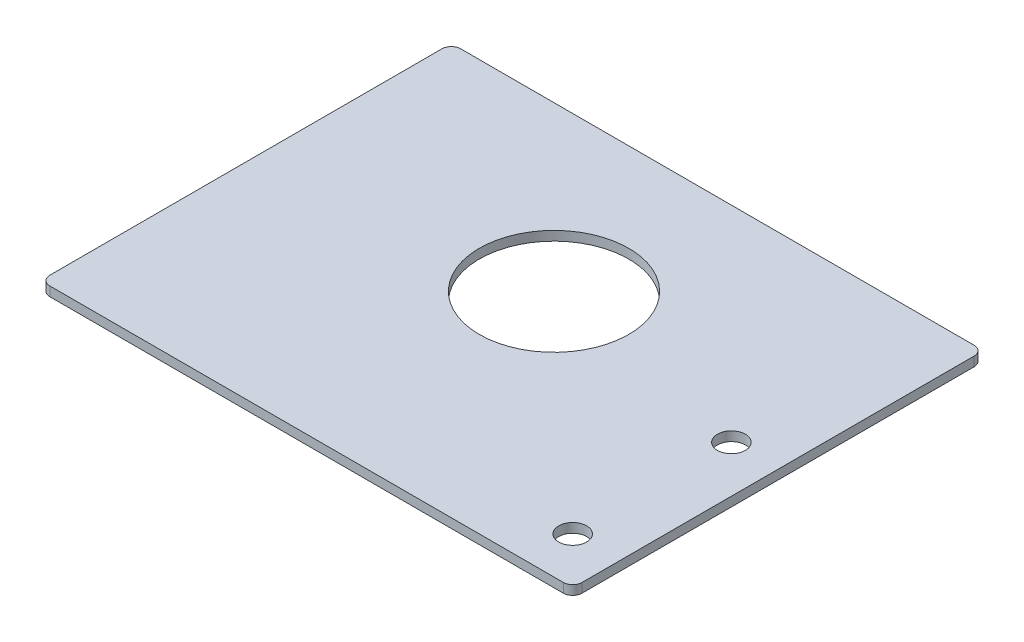
ISO-10303-21;
HEADER;
FILE_DESCRIPTION(('STEP AP214'),'2;1');
FILE_NAME('part.step','',(''),(''),'','','');
FILE_SCHEMA(('AUTOMOTIVE_DESIGN { 1 0 10303 214 1 1 1 1 }'));
ENDSEC;
DATA;
#1=APPLICATION_CONTEXT('core data for automotive mechanical design processes');
#2=APPLICATION_PROTOCOL_DEFINITION('international standard','automotive_design',2000,#1);
#3=PRODUCT_CONTEXT('',#1,'mechanical');
#4=PRODUCT('Part','Part','',(#3));
#5=PRODUCT_RELATED_PRODUCT_CATEGORY('part','',(#4));
#6=PRODUCT_DEFINITION_FORMATION('','',#4);
#7=PRODUCT_DEFINITION_CONTEXT('part definition',#1,'design');
#8=PRODUCT_DEFINITION('design','',#6,#7);
#9=PRODUCT_DEFINITION_SHAPE('','',#8);
#10=(LENGTH_UNIT() NAMED_UNIT(*) SI_UNIT(.MILLI.,.METRE.));
#11=(NAMED_UNIT(*) PLANE_ANGLE_UNIT() SI_UNIT($,.RADIAN.));
#12=(NAMED_UNIT(*) SI_UNIT($,.STERADIAN.) SOLID_ANGLE_UNIT());
#13=UNCERTAINTY_MEASURE_WITH_UNIT(LENGTH_MEASURE(1.E-05),#10,'distance_accuracy_value','');
#14=(GEOMETRIC_REPRESENTATION_CONTEXT(3) GLOBAL_UNCERTAINTY_ASSIGNED_CONTEXT((#13)) GLOBAL_UNIT_ASSIGNED_CONTEXT((#10,
#11,#12)) REPRESENTATION_CONTEXT('',''));
#15=CARTESIAN_POINT('',(0.,0.,0.));
#16=DIRECTION('',(0.,0.,1.));
#17=DIRECTION('',(1.,0.,0.));
#18=AXIS2_PLACEMENT_3D('',#15,#16,#17);
#19=CARTESIAN_POINT('',(55.,2.,42.));
#20=DIRECTION('',(0.,1.,0.));
#21=DIRECTION('',(0.,0.,1.));
#22=AXIS2_PLACEMENT_3D('',#19,#20,#21);
#23=CYLINDRICAL_SURFACE('',#22,2.);
#24=DIRECTION('',(0.,1.,0.));
#25=VECTOR('',#24,1.);
#26=CARTESIAN_POINT('',(55.,2.,44.));
#27=LINE('',#26,#25);
#28=CARTESIAN_POINT('',(55.,2.,44.));
#29=VERTEX_POINT('',#28);
#30=CARTESIAN_POINT('',(55.,4.,44.));
#31=VERTEX_POINT('',#30);
#32=EDGE_CURVE('E11',#29,#31,#27,.T.);
#33=ORIENTED_EDGE('',*,*,#32,.F.);
#34=CARTESIAN_POINT('',(55.,2.,42.));
#35=DIRECTION('',(0.,1.,0.));
#36=DIRECTION('',(0.,0.,1.));
#37=AXIS2_PLACEMENT_3D('',#34,#35,#36);
#38=CIRCLE('',#37,2.);
#39=CARTESIAN_POINT('',(57.,2.,42.));
#40=VERTEX_POINT('',#39);
#41=EDGE_CURVE('E147',#29,#40,#38,.T.);
#42=ORIENTED_EDGE('',*,*,#41,.T.);
#43=DIRECTION('',(0.,1.,0.));
#44=VECTOR('',#43,1.);
#45=CARTESIAN_POINT('',(57.,2.,42.));
#46=LINE('',#45,#44);
#47=CARTESIAN_POINT('',(57.,4.,42.));
#48=VERTEX_POINT('',#47);
#49=EDGE_CURVE('E49',#40,#48,#46,.T.);
#50=ORIENTED_EDGE('',*,*,#49,.T.);
#51=CARTESIAN_POINT('',(55.,4.,42.));
#52=DIRECTION('',(0.,1.,0.));
#53=DIRECTION('',(0.,0.,1.));
#54=AXIS2_PLACEMENT_3D('',#51,#52,#53);
#55=CIRCLE('',#54,2.);
#56=EDGE_CURVE('E146',#31,#48,#55,.T.);
#57=ORIENTED_EDGE('',*,*,#56,.F.);
#58=EDGE_LOOP('',(#33,#42,#50,#57));
#59=FACE_BOUND('',#58,.T.);
#60=ADVANCED_FACE('F39',(#59),#23,.T.);
#61=CARTESIAN_POINT('',(57.,2.,-42.));
#62=DIRECTION('',(1.,0.,0.));
#63=DIRECTION('',(0.,0.,-1.));
#64=AXIS2_PLACEMENT_3D('',#61,#62,#63);
#65=PLANE('',#64);
#66=ORIENTED_EDGE('',*,*,#49,.F.);
#67=DIRECTION('',(0.,0.,-1.));
#68=VECTOR('',#67,1.);
#69=CARTESIAN_POINT('',(57.,2.,-42.));
#70=LINE('',#69,#68);
#71=CARTESIAN_POINT('',(57.,2.,-42.));
#72=VERTEX_POINT('',#71);
#73=EDGE_CURVE('E182',#40,#72,#70,.T.);
#74=ORIENTED_EDGE('',*,*,#73,.T.);
#75=DIRECTION('',(0.,1.,0.));
#76=VECTOR('',#75,1.);
#77=CARTESIAN_POINT('',(57.,2.,-42.));
#78=LINE('',#77,#76);
#79=CARTESIAN_POINT('',(57.,4.,-42.));
#80=VERTEX_POINT('',#79);
#81=EDGE_CURVE('E140',#72,#80,#78,.T.);
#82=ORIENTED_EDGE('',*,*,#81,.T.);
#83=DIRECTION('',(0.,0.,1.));
#84=VECTOR('',#83,1.);
#85=CARTESIAN_POINT('',(57.,4.,42.));
#86=LINE('',#85,#84);
#87=EDGE_CURVE('E158',#48,#80,#86,.F.);
#88=ORIENTED_EDGE('',*,*,#87,.F.);
#89=EDGE_LOOP('',(#66,#74,#82,#88));
#90=FACE_BOUND('',#89,.T.);
#91=ADVANCED_FACE('F163',(#90),#65,.T.);
#92=CARTESIAN_POINT('',(55.,2.,-42.));
#93=DIRECTION('',(0.,1.,0.));
#94=DIRECTION('',(0.,0.,1.));
#95=AXIS2_PLACEMENT_3D('',#92,#93,#94);
#96=CYLINDRICAL_SURFACE('',#95,2.);
#97=ORIENTED_EDGE('',*,*,#81,.F.);
#98=CARTESIAN_POINT('',(55.,2.,-42.));
#99=DIRECTION('',(0.,1.,0.));
#100=DIRECTION('',(0.,0.,1.));
#101=AXIS2_PLACEMENT_3D('',#98,#99,#100);
#102=CIRCLE('',#101,2.);
#103=CARTESIAN_POINT('',(55.,2.,-44.));
#104=VERTEX_POINT('',#103);
#105=EDGE_CURVE('E184',#72,#104,#102,.T.);
#106=ORIENTED_EDGE('',*,*,#105,.T.);
#107=DIRECTION('',(0.,1.,0.));
#108=VECTOR('',#107,1.);
#109=CARTESIAN_POINT('',(55.,2.,-44.));
#110=LINE('',#109,#108);
#111=CARTESIAN_POINT('',(55.,4.,-44.));
#112=VERTEX_POINT('',#111);
#113=EDGE_CURVE('E138',#104,#112,#110,.T.);
#114=ORIENTED_EDGE('',*,*,#113,.T.);
#115=CARTESIAN_POINT('',(55.,4.,-42.));
#116=DIRECTION('',(0.,1.,0.));
#117=DIRECTION('',(0.,0.,1.));
#118=AXIS2_PLACEMENT_3D('',#115,#116,#117);
#119=CIRCLE('',#118,2.);
#120=EDGE_CURVE('E164',#80,#112,#119,.T.);
#121=ORIENTED_EDGE('',*,*,#120,.F.);
#122=EDGE_LOOP('',(#97,#106,#114,#121));
#123=FACE_BOUND('',#122,.T.);
#124=ADVANCED_FACE('F194',(#123),#96,.T.);
#125=CARTESIAN_POINT('',(-55.,2.,-44.));
#126=DIRECTION('',(0.,0.,-1.));
#127=DIRECTION('',(-1.,0.,0.));
#128=AXIS2_PLACEMENT_3D('',#125,#126,#127);
#129=PLANE('',#128);
#130=ORIENTED_EDGE('',*,*,#113,.F.);
#131=DIRECTION('',(-1.,0.,0.));
#132=VECTOR('',#131,1.);
#133=CARTESIAN_POINT('',(-55.,2.,-44.));
#134=LINE('',#133,#132);
#135=CARTESIAN_POINT('',(-55.,2.,-44.));
#136=VERTEX_POINT('',#135);
#137=EDGE_CURVE('E128',#104,#136,#134,.T.);
#138=ORIENTED_EDGE('',*,*,#137,.T.);
#139=DIRECTION('',(0.,1.,0.));
#140=VECTOR('',#139,1.);
#141=CARTESIAN_POINT('',(-55.,2.,-44.));
#142=LINE('',#141,#140);
#143=CARTESIAN_POINT('',(-55.,4.,-44.));
#144=VERTEX_POINT('',#143);
#145=EDGE_CURVE('E136',#136,#144,#142,.T.);
#146=ORIENTED_EDGE('',*,*,#145,.T.);
#147=DIRECTION('',(1.,0.,0.));
#148=VECTOR('',#147,1.);
#149=CARTESIAN_POINT('',(-55.,4.,-44.));
#150=LINE('',#149,#148);
#151=EDGE_CURVE('E166',#112,#144,#150,.F.);
#152=ORIENTED_EDGE('',*,*,#151,.F.);
#153=EDGE_LOOP('',(#130,#138,#146,#152));
#154=FACE_BOUND('',#153,.T.);
#155=ADVANCED_FACE('F189',(#154),#129,.T.);
#156=CARTESIAN_POINT('',(-55.,2.,-42.));
#157=DIRECTION('',(0.,1.,0.));
#158=DIRECTION('',(0.,0.,1.));
#159=AXIS2_PLACEMENT_3D('',#156,#157,#158);
#160=CYLINDRICAL_SURFACE('',#159,2.);
#161=ORIENTED_EDGE('',*,*,#145,.F.);
#162=CARTESIAN_POINT('',(-55.,2.,-42.));
#163=DIRECTION('',(0.,1.,0.));
#164=DIRECTION('',(0.,0.,1.));
#165=AXIS2_PLACEMENT_3D('',#162,#163,#164);
#166=CIRCLE('',#165,2.);
#167=CARTESIAN_POINT('',(-57.,2.,-42.));
#168=VERTEX_POINT('',#167);
#169=EDGE_CURVE('E123',#136,#168,#166,.T.);
#170=ORIENTED_EDGE('',*,*,#169,.T.);
#171=DIRECTION('',(0.,1.,0.));
#172=VECTOR('',#171,1.);
#173=CARTESIAN_POINT('',(-57.,2.,-42.));
#174=LINE('',#173,#172);
#175=CARTESIAN_POINT('',(-57.,4.,-42.));
#176=VERTEX_POINT('',#175);
#177=EDGE_CURVE('E98',#168,#176,#174,.T.);
#178=ORIENTED_EDGE('',*,*,#177,.T.);
#179=CARTESIAN_POINT('',(-55.,4.,-42.));
#180=DIRECTION('',(0.,1.,0.));
#181=DIRECTION('',(0.,0.,1.));
#182=AXIS2_PLACEMENT_3D('',#179,#180,#181);
#183=CIRCLE('',#182,2.);
#184=EDGE_CURVE('E197',#144,#176,#183,.T.);
#185=ORIENTED_EDGE('',*,*,#184,.F.);
#186=EDGE_LOOP('',(#161,#170,#178,#185));
#187=FACE_BOUND('',#186,.T.);
#188=ADVANCED_FACE('F287',(#187),#160,.T.);
#189=CARTESIAN_POINT('',(-57.,2.,-42.));
#190=DIRECTION('',(-1.,0.,0.));
#191=DIRECTION('',(0.,0.,1.));
#192=AXIS2_PLACEMENT_3D('',#189,#190,#191);
#193=PLANE('',#192);
#194=ORIENTED_EDGE('',*,*,#177,.F.);
#195=DIRECTION('',(0.,0.,1.));
#196=VECTOR('',#195,1.);
#197=CARTESIAN_POINT('',(-57.,2.,-42.));
#198=LINE('',#197,#196);
#199=CARTESIAN_POINT('',(-57.,2.,42.));
#200=VERTEX_POINT('',#199);
#201=EDGE_CURVE('E115',#168,#200,#198,.T.);
#202=ORIENTED_EDGE('',*,*,#201,.T.);
#203=DIRECTION('',(0.,1.,0.));
#204=VECTOR('',#203,1.);
#205=CARTESIAN_POINT('',(-57.,2.,42.));
#206=LINE('',#205,#204);
#207=CARTESIAN_POINT('',(-57.,4.,42.));
#208=VERTEX_POINT('',#207);
#209=EDGE_CURVE('E57',#200,#208,#206,.T.);
#210=ORIENTED_EDGE('',*,*,#209,.T.);
#211=DIRECTION('',(0.,0.,1.));
#212=VECTOR('',#211,1.);
#213=CARTESIAN_POINT('',(-57.,4.,42.));
#214=LINE('',#213,#212);
#215=EDGE_CURVE('E175',#176,#208,#214,.T.);
#216=ORIENTED_EDGE('',*,*,#215,.F.);
#217=EDGE_LOOP('',(#194,#202,#210,#216));
#218=FACE_BOUND('',#217,.T.);
#219=ADVANCED_FACE('F121',(#218),#193,.T.);
#220=CARTESIAN_POINT('',(-55.,2.,42.));
#221=DIRECTION('',(0.,1.,0.));
#222=DIRECTION('',(0.,0.,1.));
#223=AXIS2_PLACEMENT_3D('',#220,#221,#222);
#224=CYLINDRICAL_SURFACE('',#223,2.);
#225=ORIENTED_EDGE('',*,*,#209,.F.);
#226=CARTESIAN_POINT('',(-55.,2.,42.));
#227=DIRECTION('',(0.,1.,0.));
#228=DIRECTION('',(0.,0.,1.));
#229=AXIS2_PLACEMENT_3D('',#226,#227,#228);
#230=CIRCLE('',#229,2.);
#231=CARTESIAN_POINT('',(-55.,2.,44.));
#232=VERTEX_POINT('',#231);
#233=EDGE_CURVE('E104',#200,#232,#230,.T.);
#234=ORIENTED_EDGE('',*,*,#233,.T.);
#235=DIRECTION('',(0.,1.,0.));
#236=VECTOR('',#235,1.);
#237=CARTESIAN_POINT('',(-55.,2.,44.));
#238=LINE('',#237,#236);
#239=CARTESIAN_POINT('',(-55.,4.,44.));
#240=VERTEX_POINT('',#239);
#241=EDGE_CURVE('E43',#232,#240,#238,.T.);
#242=ORIENTED_EDGE('',*,*,#241,.T.);
#243=CARTESIAN_POINT('',(-55.,4.,42.));
#244=DIRECTION('',(0.,1.,0.));
#245=DIRECTION('',(0.,0.,1.));
#246=AXIS2_PLACEMENT_3D('',#243,#244,#245);
#247=CIRCLE('',#246,2.);
#248=EDGE_CURVE('E106',#208,#240,#247,.T.);
#249=ORIENTED_EDGE('',*,*,#248,.F.);
#250=EDGE_LOOP('',(#225,#234,#242,#249));
#251=FACE_BOUND('',#250,.T.);
#252=ADVANCED_FACE('F103',(#251),#224,.T.);
#253=CARTESIAN_POINT('',(47.,2.,0.));
#254=DIRECTION('',(0.,1.,0.));
#255=DIRECTION('',(0.,0.,1.));
#256=AXIS2_PLACEMENT_3D('',#253,#254,#255);
#257=CYLINDRICAL_SURFACE('',#256,3.);
#258=CARTESIAN_POINT('',(47.,4.,0.));
#259=DIRECTION('',(0.,1.,0.));
#260=DIRECTION('',(0.,0.,1.));
#261=AXIS2_PLACEMENT_3D('',#258,#259,#260);
#262=CIRCLE('',#261,3.);
#263=CARTESIAN_POINT('',(47.,4.,3.));
#264=VERTEX_POINT('',#263);
#265=EDGE_CURVE('E133',#264,#264,#262,.T.);
#266=ORIENTED_EDGE('',*,*,#265,.T.);
#267=EDGE_LOOP('',(#266));
#268=FACE_BOUND('',#267,.T.);
#269=CARTESIAN_POINT('',(47.,2.,0.));
#270=DIRECTION('',(0.,1.,0.));
#271=DIRECTION('',(0.,0.,1.));
#272=AXIS2_PLACEMENT_3D('',#269,#270,#271);
#273=CIRCLE('',#272,3.);
#274=CARTESIAN_POINT('',(47.,2.,3.));
#275=VERTEX_POINT('',#274);
#276=EDGE_CURVE('E119',#275,#275,#273,.T.);
#277=ORIENTED_EDGE('',*,*,#276,.F.);
#278=EDGE_LOOP('',(#277));
#279=FACE_BOUND('',#278,.T.);
#280=ADVANCED_FACE('F205',(#268,#279),#257,.F.);
#281=CARTESIAN_POINT('',(-55.,2.,44.));
#282=DIRECTION('',(0.,0.,1.));
#283=DIRECTION('',(1.,0.,0.));
#284=AXIS2_PLACEMENT_3D('',#281,#282,#283);
#285=PLANE('',#284);
#286=DIRECTION('',(1.,0.,0.));
#287=VECTOR('',#286,1.);
#288=CARTESIAN_POINT('',(-55.,2.,44.));
#289=LINE('',#288,#287);
#290=EDGE_CURVE('E118',#232,#29,#289,.T.);
#291=ORIENTED_EDGE('',*,*,#290,.T.);
#292=ORIENTED_EDGE('',*,*,#32,.T.);
#293=DIRECTION('',(1.,0.,0.));
#294=VECTOR('',#293,1.);
#295=CARTESIAN_POINT('',(-55.,4.,44.));
#296=LINE('',#295,#294);
#297=EDGE_CURVE('E161',#240,#31,#296,.T.);
#298=ORIENTED_EDGE('',*,*,#297,.F.);
#299=ORIENTED_EDGE('',*,*,#241,.F.);
#300=EDGE_LOOP('',(#291,#292,#298,#299));
#301=FACE_BOUND('',#300,.T.);
#302=ADVANCED_FACE('F226',(#301),#285,.T.);
#303=CARTESIAN_POINT('',(0.,2.,-8.99999999999999));
#304=DIRECTION('',(0.,1.,0.));
#305=DIRECTION('',(0.,0.,1.));
#306=AXIS2_PLACEMENT_3D('',#303,#304,#305);
#307=CYLINDRICAL_SURFACE('',#306,16.);
#308=CARTESIAN_POINT('',(0.,4.,-8.99999999999999));
#309=DIRECTION('',(0.,1.,0.));
#310=DIRECTION('',(0.,0.,1.));
#311=AXIS2_PLACEMENT_3D('',#308,#309,#310);
#312=CIRCLE('',#311,16.);
#313=CARTESIAN_POINT('',(0.,4.,7.00000000000001));
#314=VERTEX_POINT('',#313);
#315=EDGE_CURVE('E171',#314,#314,#312,.T.);
#316=ORIENTED_EDGE('',*,*,#315,.T.);
#317=EDGE_LOOP('',(#316));
#318=FACE_BOUND('',#317,.T.);
#319=CARTESIAN_POINT('',(0.,2.,-8.99999999999999));
#320=DIRECTION('',(0.,1.,0.));
#321=DIRECTION('',(0.,0.,1.));
#322=AXIS2_PLACEMENT_3D('',#319,#320,#321);
#323=CIRCLE('',#322,16.);
#324=CARTESIAN_POINT('',(0.,2.,7.00000000000001));
#325=VERTEX_POINT('',#324);
#326=EDGE_CURVE('E122',#325,#325,#323,.T.);
#327=ORIENTED_EDGE('',*,*,#326,.F.);
#328=EDGE_LOOP('',(#327));
#329=FACE_BOUND('',#328,.T.);
#330=ADVANCED_FACE('F216',(#318,#329),#307,.F.);
#331=CARTESIAN_POINT('',(47.,2.,34.));
#332=DIRECTION('',(0.,1.,0.));
#333=DIRECTION('',(0.,0.,1.));
#334=AXIS2_PLACEMENT_3D('',#331,#332,#333);
#335=CYLINDRICAL_SURFACE('',#334,3.);
#336=CARTESIAN_POINT('',(47.,4.,34.));
#337=DIRECTION('',(0.,1.,0.));
#338=DIRECTION('',(0.,0.,1.));
#339=AXIS2_PLACEMENT_3D('',#336,#337,#338);
#340=CIRCLE('',#339,3.);
#341=CARTESIAN_POINT('',(47.,4.,37.));
#342=VERTEX_POINT('',#341);
#343=EDGE_CURVE('E174',#342,#342,#340,.T.);
#344=ORIENTED_EDGE('',*,*,#343,.T.);
#345=EDGE_LOOP('',(#344));
#346=FACE_BOUND('',#345,.T.);
#347=CARTESIAN_POINT('',(47.,2.,34.));
#348=DIRECTION('',(0.,1.,0.));
#349=DIRECTION('',(0.,0.,1.));
#350=AXIS2_PLACEMENT_3D('',#347,#348,#349);
#351=CIRCLE('',#350,3.);
#352=CARTESIAN_POINT('',(47.,2.,37.));
#353=VERTEX_POINT('',#352);
#354=EDGE_CURVE('E126',#353,#353,#351,.T.);
#355=ORIENTED_EDGE('',*,*,#354,.F.);
#356=EDGE_LOOP('',(#355));
#357=FACE_BOUND('',#356,.T.);
#358=ADVANCED_FACE('F41',(#346,#357),#335,.F.);
#359=CARTESIAN_POINT('',(-55.,4.,42.));
#360=DIRECTION('',(0.,1.,0.));
#361=DIRECTION('',(0.,0.,1.));
#362=AXIS2_PLACEMENT_3D('',#359,#360,#361);
#363=PLANE('',#362);
#364=ORIENTED_EDGE('',*,*,#265,.F.);
#365=EDGE_LOOP('',(#364));
#366=FACE_BOUND('',#365,.T.);
#367=ORIENTED_EDGE('',*,*,#248,.T.);
#368=ORIENTED_EDGE('',*,*,#297,.T.);
#369=ORIENTED_EDGE('',*,*,#56,.T.);
#370=ORIENTED_EDGE('',*,*,#87,.T.);
#371=ORIENTED_EDGE('',*,*,#120,.T.);
#372=ORIENTED_EDGE('',*,*,#151,.T.);
#373=ORIENTED_EDGE('',*,*,#184,.T.);
#374=ORIENTED_EDGE('',*,*,#215,.T.);
#375=EDGE_LOOP('',(#367,#368,#369,#370,#371,#372,#373,#374));
#376=FACE_BOUND('',#375,.T.);
#377=ORIENTED_EDGE('',*,*,#315,.F.);
#378=EDGE_LOOP('',(#377));
#379=FACE_BOUND('',#378,.T.);
#380=ORIENTED_EDGE('',*,*,#343,.F.);
#381=EDGE_LOOP('',(#380));
#382=FACE_BOUND('',#381,.T.);
#383=ADVANCED_FACE('F155',(#366,#376,#379,#382),#363,.T.);
#384=CARTESIAN_POINT('',(-55.,2.,42.));
#385=DIRECTION('',(0.,1.,0.));
#386=DIRECTION('',(0.,0.,1.));
#387=AXIS2_PLACEMENT_3D('',#384,#385,#386);
#388=PLANE('',#387);
#389=ORIENTED_EDGE('',*,*,#276,.T.);
#390=EDGE_LOOP('',(#389));
#391=FACE_BOUND('',#390,.T.);
#392=ORIENTED_EDGE('',*,*,#233,.F.);
#393=ORIENTED_EDGE('',*,*,#201,.F.);
#394=ORIENTED_EDGE('',*,*,#169,.F.);
#395=ORIENTED_EDGE('',*,*,#137,.F.);
#396=ORIENTED_EDGE('',*,*,#105,.F.);
#397=ORIENTED_EDGE('',*,*,#73,.F.);
#398=ORIENTED_EDGE('',*,*,#41,.F.);
#399=ORIENTED_EDGE('',*,*,#290,.F.);
#400=EDGE_LOOP('',(#392,#393,#394,#395,#396,#397,#398,#399));
#401=FACE_BOUND('',#400,.T.);
#402=ORIENTED_EDGE('',*,*,#326,.T.);
#403=EDGE_LOOP('',(#402));
#404=FACE_BOUND('',#403,.T.);
#405=ORIENTED_EDGE('',*,*,#354,.T.);
#406=EDGE_LOOP('',(#405));
#407=FACE_BOUND('',#406,.T.);
#408=ADVANCED_FACE('F112',(#391,#401,#404,#407),#388,.F.);
#409=CLOSED_SHELL('',(#60,#91,#124,#155,#188,#219,#252,#280,#302,#330,#358,#383,#408));
#410=MANIFOLD_SOLID_BREP('B2',#409);
#411=ADVANCED_BREP_SHAPE_REPRESENTATION('',(#18,#410),#14);
#412=SHAPE_DEFINITION_REPRESENTATION(#9,#411);
ENDSEC;
END-ISO-10303-21;
